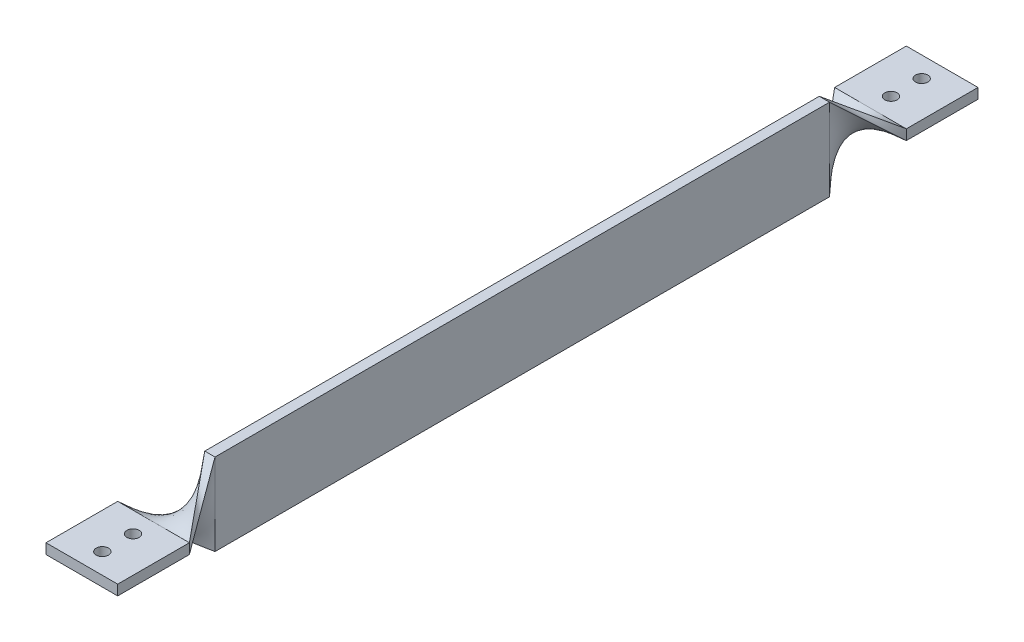
ISO-10303-21;
HEADER;
FILE_DESCRIPTION(('STEP AP214'),'2;1');
FILE_NAME('part.step','',(''),(''),'','','');
FILE_SCHEMA(('AUTOMOTIVE_DESIGN { 1 0 10303 214 1 1 1 1 }'));
ENDSEC;
DATA;
#1=APPLICATION_CONTEXT('core data for automotive mechanical design processes');
#2=APPLICATION_PROTOCOL_DEFINITION('international standard','automotive_design',2000,#1);
#3=PRODUCT_CONTEXT('',#1,'mechanical');
#4=PRODUCT('Part','Part','',(#3));
#5=PRODUCT_RELATED_PRODUCT_CATEGORY('part','',(#4));
#6=PRODUCT_DEFINITION_FORMATION('','',#4);
#7=PRODUCT_DEFINITION_CONTEXT('part definition',#1,'design');
#8=PRODUCT_DEFINITION('design','',#6,#7);
#9=PRODUCT_DEFINITION_SHAPE('','',#8);
#10=(LENGTH_UNIT() NAMED_UNIT(*) SI_UNIT(.MILLI.,.METRE.));
#11=(NAMED_UNIT(*) PLANE_ANGLE_UNIT() SI_UNIT($,.RADIAN.));
#12=(NAMED_UNIT(*) SI_UNIT($,.STERADIAN.) SOLID_ANGLE_UNIT());
#13=UNCERTAINTY_MEASURE_WITH_UNIT(LENGTH_MEASURE(1.E-05),#10,'distance_accuracy_value','');
#14=(GEOMETRIC_REPRESENTATION_CONTEXT(3) GLOBAL_UNCERTAINTY_ASSIGNED_CONTEXT((#13)) GLOBAL_UNIT_ASSIGNED_CONTEXT((#10,
#11,#12)) REPRESENTATION_CONTEXT('',''));
#15=CARTESIAN_POINT('',(0.,0.,0.));
#16=DIRECTION('',(0.,0.,1.));
#17=DIRECTION('',(1.,0.,0.));
#18=AXIS2_PLACEMENT_3D('',#15,#16,#17);
#19=CARTESIAN_POINT('',(0.,0.,17.5));
#20=DIRECTION('',(1.,0.,0.));
#21=DIRECTION('',(0.,0.,-1.));
#22=AXIS2_PLACEMENT_3D('',#19,#20,#21);
#23=PLANE('',#22);
#24=DIRECTION('',(0.,-1.,0.));
#25=VECTOR('',#24,1.);
#26=CARTESIAN_POINT('',(0.,0.,-17.5));
#27=LINE('',#26,#25);
#28=CARTESIAN_POINT('',(0.,5.,-17.5));
#29=VERTEX_POINT('',#28);
#30=CARTESIAN_POINT('',(0.,0.,-17.5));
#31=VERTEX_POINT('',#30);
#32=EDGE_CURVE('E145',#29,#31,#27,.T.);
#33=ORIENTED_EDGE('',*,*,#32,.T.);
#34=DIRECTION('',(0.,0.,-1.));
#35=VECTOR('',#34,1.);
#36=CARTESIAN_POINT('',(0.,0.,17.5));
#37=LINE('',#36,#35);
#38=CARTESIAN_POINT('',(0.,0.,17.5));
#39=VERTEX_POINT('',#38);
#40=EDGE_CURVE('E12',#39,#31,#37,.T.);
#41=ORIENTED_EDGE('',*,*,#40,.F.);
#42=DIRECTION('',(0.,1.,0.));
#43=VECTOR('',#42,1.);
#44=CARTESIAN_POINT('',(0.,0.,17.5));
#45=LINE('',#44,#43);
#46=CARTESIAN_POINT('',(0.,5.,17.5));
#47=VERTEX_POINT('',#46);
#48=EDGE_CURVE('E138',#47,#39,#45,.F.);
#49=ORIENTED_EDGE('',*,*,#48,.F.);
#50=DIRECTION('',(0.,0.,-1.));
#51=VECTOR('',#50,1.);
#52=CARTESIAN_POINT('',(0.,5.,17.5));
#53=LINE('',#52,#51);
#54=EDGE_CURVE('E133',#47,#29,#53,.T.);
#55=ORIENTED_EDGE('',*,*,#54,.T.);
#56=EDGE_LOOP('',(#33,#41,#49,#55));
#57=FACE_BOUND('',#56,.T.);
#58=ADVANCED_FACE('F54',(#57),#23,.F.);
#59=CARTESIAN_POINT('',(0.,0.,17.5));
#60=DIRECTION('',(0.,1.,0.));
#61=DIRECTION('',(0.,0.,1.));
#62=AXIS2_PLACEMENT_3D('',#59,#60,#61);
#63=PLANE('',#62);
#64=CARTESIAN_POINT('',(17.5,0.,-7.5));
#65=DIRECTION('',(0.,1.,0.));
#66=DIRECTION('',(0.,0.,1.));
#67=AXIS2_PLACEMENT_3D('',#64,#65,#66);
#68=CIRCLE('',#67,3.);
#69=CARTESIAN_POINT('',(17.5,0.,-4.5));
#70=VERTEX_POINT('',#69);
#71=EDGE_CURVE('E385',#70,#70,#68,.T.);
#72=ORIENTED_EDGE('',*,*,#71,.T.);
#73=EDGE_LOOP('',(#72));
#74=FACE_BOUND('',#73,.T.);
#75=CARTESIAN_POINT('',(17.5,0.,7.5));
#76=DIRECTION('',(0.,1.,0.));
#77=DIRECTION('',(0.,0.,1.));
#78=AXIS2_PLACEMENT_3D('',#75,#76,#77);
#79=CIRCLE('',#78,3.);
#80=CARTESIAN_POINT('',(17.5,0.,10.5));
#81=VERTEX_POINT('',#80);
#82=EDGE_CURVE('E389',#81,#81,#79,.T.);
#83=ORIENTED_EDGE('',*,*,#82,.T.);
#84=EDGE_LOOP('',(#83));
#85=FACE_BOUND('',#84,.T.);
#86=DIRECTION('',(1.,0.,0.));
#87=VECTOR('',#86,1.);
#88=CARTESIAN_POINT('',(0.,0.,-17.5));
#89=LINE('',#88,#87);
#90=CARTESIAN_POINT('',(35.,0.,-17.5));
#91=VERTEX_POINT('',#90);
#92=EDGE_CURVE('E150',#31,#91,#89,.T.);
#93=ORIENTED_EDGE('',*,*,#92,.T.);
#94=DIRECTION('',(0.,0.,-1.));
#95=VECTOR('',#94,1.);
#96=CARTESIAN_POINT('',(35.,0.,17.5));
#97=LINE('',#96,#95);
#98=CARTESIAN_POINT('',(35.,0.,17.5));
#99=VERTEX_POINT('',#98);
#100=EDGE_CURVE('E64',#99,#91,#97,.T.);
#101=ORIENTED_EDGE('',*,*,#100,.F.);
#102=DIRECTION('',(1.,0.,0.));
#103=VECTOR('',#102,1.);
#104=CARTESIAN_POINT('',(0.,0.,17.5));
#105=LINE('',#104,#103);
#106=EDGE_CURVE('E166',#39,#99,#105,.T.);
#107=ORIENTED_EDGE('',*,*,#106,.F.);
#108=ORIENTED_EDGE('',*,*,#40,.T.);
#109=EDGE_LOOP('',(#93,#101,#107,#108));
#110=FACE_BOUND('',#109,.T.);
#111=ADVANCED_FACE('F376',(#74,#85,#110),#63,.F.);
#112=CARTESIAN_POINT('',(35.,0.,17.5));
#113=DIRECTION('',(-1.,0.,0.));
#114=DIRECTION('',(0.,0.,1.));
#115=AXIS2_PLACEMENT_3D('',#112,#113,#114);
#116=PLANE('',#115);
#117=DIRECTION('',(0.,1.,0.));
#118=VECTOR('',#117,1.);
#119=CARTESIAN_POINT('',(35.,0.,-17.5));
#120=LINE('',#119,#118);
#121=CARTESIAN_POINT('',(35.,5.,-17.5));
#122=VERTEX_POINT('',#121);
#123=EDGE_CURVE('E139',#91,#122,#120,.T.);
#124=ORIENTED_EDGE('',*,*,#123,.T.);
#125=DIRECTION('',(0.,0.,-1.));
#126=VECTOR('',#125,1.);
#127=CARTESIAN_POINT('',(35.,5.,17.5));
#128=LINE('',#127,#126);
#129=CARTESIAN_POINT('',(35.,5.,17.5));
#130=VERTEX_POINT('',#129);
#131=EDGE_CURVE('E73',#130,#122,#128,.T.);
#132=ORIENTED_EDGE('',*,*,#131,.F.);
#133=DIRECTION('',(0.,1.,0.));
#134=VECTOR('',#133,1.);
#135=CARTESIAN_POINT('',(35.,0.,17.5));
#136=LINE('',#135,#134);
#137=EDGE_CURVE('E169',#99,#130,#136,.T.);
#138=ORIENTED_EDGE('',*,*,#137,.F.);
#139=ORIENTED_EDGE('',*,*,#100,.T.);
#140=EDGE_LOOP('',(#124,#132,#138,#139));
#141=FACE_BOUND('',#140,.T.);
#142=ADVANCED_FACE('F373',(#141),#116,.F.);
#143=CARTESIAN_POINT('',(0.,5.,17.5));
#144=DIRECTION('',(0.,-1.,0.));
#145=DIRECTION('',(1.,0.,0.));
#146=AXIS2_PLACEMENT_3D('',#143,#144,#145);
#147=PLANE('',#146);
#148=CARTESIAN_POINT('',(17.5,5.,-7.5));
#149=DIRECTION('',(0.,1.,0.));
#150=DIRECTION('',(0.,0.,1.));
#151=AXIS2_PLACEMENT_3D('',#148,#149,#150);
#152=CIRCLE('',#151,3.);
#153=CARTESIAN_POINT('',(17.5,5.,-4.5));
#154=VERTEX_POINT('',#153);
#155=EDGE_CURVE('E613',#154,#154,#152,.T.);
#156=ORIENTED_EDGE('',*,*,#155,.F.);
#157=EDGE_LOOP('',(#156));
#158=FACE_BOUND('',#157,.T.);
#159=CARTESIAN_POINT('',(17.5,5.,7.5));
#160=DIRECTION('',(0.,1.,0.));
#161=DIRECTION('',(0.,0.,1.));
#162=AXIS2_PLACEMENT_3D('',#159,#160,#161);
#163=CIRCLE('',#162,3.);
#164=CARTESIAN_POINT('',(17.5,5.,10.5));
#165=VERTEX_POINT('',#164);
#166=EDGE_CURVE('E614',#165,#165,#163,.T.);
#167=ORIENTED_EDGE('',*,*,#166,.F.);
#168=EDGE_LOOP('',(#167));
#169=FACE_BOUND('',#168,.T.);
#170=DIRECTION('',(-1.,0.,0.));
#171=VECTOR('',#170,1.);
#172=CARTESIAN_POINT('',(0.,5.,-17.5));
#173=LINE('',#172,#171);
#174=EDGE_CURVE('E130',#122,#29,#173,.T.);
#175=ORIENTED_EDGE('',*,*,#174,.T.);
#176=ORIENTED_EDGE('',*,*,#54,.F.);
#177=DIRECTION('',(1.,0.,0.));
#178=VECTOR('',#177,1.);
#179=CARTESIAN_POINT('',(0.,5.,17.5));
#180=LINE('',#179,#178);
#181=EDGE_CURVE('E147',#130,#47,#180,.F.);
#182=ORIENTED_EDGE('',*,*,#181,.F.);
#183=ORIENTED_EDGE('',*,*,#131,.T.);
#184=EDGE_LOOP('',(#175,#176,#182,#183));
#185=FACE_BOUND('',#184,.T.);
#186=ADVANCED_FACE('F132',(#158,#169,#185),#147,.F.);
#187=CARTESIAN_POINT('',(0.,0.,-17.5));
#188=DIRECTION('',(0.,0.,-1.));
#189=DIRECTION('',(-1.,0.,0.));
#190=AXIS2_PLACEMENT_3D('',#187,#188,#189);
#191=PLANE('',#190);
#192=ORIENTED_EDGE('',*,*,#32,.F.);
#193=ORIENTED_EDGE('',*,*,#174,.F.);
#194=ORIENTED_EDGE('',*,*,#123,.F.);
#195=ORIENTED_EDGE('',*,*,#92,.F.);
#196=EDGE_LOOP('',(#192,#193,#194,#195));
#197=FACE_BOUND('',#196,.T.);
#198=ADVANCED_FACE('F149',(#197),#191,.T.);
#199=CARTESIAN_POINT('',(35.,0.,17.5));
#200=CARTESIAN_POINT('',(22.5,22.5,42.5));
#201=CARTESIAN_POINT('',(35.,0.833333333333334,17.5));
#202=CARTESIAN_POINT('',(21.6666666666667,22.5,42.5));
#203=CARTESIAN_POINT('',(35.,1.66666666666667,17.5));
#204=CARTESIAN_POINT('',(20.8333333333334,22.5,42.5));
#205=CARTESIAN_POINT('',(35.,3.33333333333333,17.5));
#206=CARTESIAN_POINT('',(19.1666666666667,22.5,42.5));
#207=CARTESIAN_POINT('',(35.,4.16666666666667,17.5));
#208=CARTESIAN_POINT('',(18.3333333333333,22.5,42.5));
#209=CARTESIAN_POINT('',(35.,5.,17.5));
#210=CARTESIAN_POINT('',(17.5,22.5,42.5));
#211=B_SPLINE_SURFACE_WITH_KNOTS('',3,1,((#199,#200),(#201,#202),(#203,#204),(#205,#206),(#207,
#208),(#209,#210)),.UNSPECIFIED.,.F.,.F.,.F.,(4,2,4),(2,2),(0.,0.5,1.),(0.,1.),.UNSPECIFIED.);
#212=DIRECTION('',(-0.497468338163091,0.497468338163091,0.710669054518701));
#213=VECTOR('',#212,1.);
#214=CARTESIAN_POINT('',(26.25,13.75,30.));
#215=LINE('',#214,#213);
#216=CARTESIAN_POINT('',(17.5,22.5,42.5));
#217=VERTEX_POINT('',#216);
#218=EDGE_CURVE('E106',#130,#217,#215,.T.);
#219=DIRECTION('',(-1.,0.,0.));
#220=VECTOR('',#219,1.);
#221=CARTESIAN_POINT('',(17.5,22.5,42.5));
#222=LINE('',#221,#220);
#223=CARTESIAN_POINT('',(22.5,22.5,42.5));
#224=VERTEX_POINT('',#223);
#225=EDGE_CURVE('E185',#224,#217,#222,.T.);
#226=DIRECTION('',(0.348366507145809,-0.627059712862456,-0.696733014291618));
#227=VECTOR('',#226,1.);
#228=CARTESIAN_POINT('',(28.75,11.25,30.));
#229=LINE('',#228,#227);
#230=EDGE_CURVE('E322',#224,#99,#229,.T.);
#231=ORIENTED_EDGE('',*,*,#137,.T.);
#232=ORIENTED_EDGE('',*,*,#218,.T.);
#233=ORIENTED_EDGE('',*,*,#225,.F.);
#234=ORIENTED_EDGE('',*,*,#230,.T.);
#235=EDGE_LOOP('',(#231,#232,#233,#234));
#236=FACE_BOUND('',#235,.T.);
#237=ADVANCED_FACE('F370',(#236),#211,.T.);
#238=CARTESIAN_POINT('',(35.,5.,17.5));
#239=CARTESIAN_POINT('',(17.5,22.5,42.5));
#240=CARTESIAN_POINT('',(29.1666666666665,5.,17.5));
#241=CARTESIAN_POINT('',(17.5,15.8333333333333,42.5));
#242=CARTESIAN_POINT('',(23.333333333333,5.,17.5));
#243=CARTESIAN_POINT('',(17.5,9.16666666666665,42.5));
#244=CARTESIAN_POINT('',(11.6666666666663,5.,17.5));
#245=CARTESIAN_POINT('',(17.5,-4.16666666666668,42.5));
#246=CARTESIAN_POINT('',(5.83333333333312,5.,17.5));
#247=CARTESIAN_POINT('',(17.5,-10.8333333333333,42.5));
#248=CARTESIAN_POINT('',(0.,5.,17.5));
#249=CARTESIAN_POINT('',(17.5,-17.5,42.5));
#250=B_SPLINE_SURFACE_WITH_KNOTS('',3,1,((#238,#239),(#240,#241),(#242,#243),(#244,#245),(#246,
#247),(#248,#249)),.UNSPECIFIED.,.F.,.F.,.F.,(4,2,4),(2,2),(0.,0.5,1.),(0.,1.),.UNSPECIFIED.);
#251=DIRECTION('',(0.461566331377051,-0.593442426056208,0.659380473395787));
#252=VECTOR('',#251,1.);
#253=CARTESIAN_POINT('',(8.75,-6.25,30.));
#254=LINE('',#253,#252);
#255=CARTESIAN_POINT('',(17.5,-17.5,42.5));
#256=VERTEX_POINT('',#255);
#257=EDGE_CURVE('E321',#47,#256,#254,.T.);
#258=DIRECTION('',(0.,-1.,0.));
#259=VECTOR('',#258,1.);
#260=CARTESIAN_POINT('',(17.5,22.5,42.5));
#261=LINE('',#260,#259);
#262=EDGE_CURVE('E237',#217,#256,#261,.T.);
#263=ORIENTED_EDGE('',*,*,#181,.T.);
#264=ORIENTED_EDGE('',*,*,#257,.T.);
#265=ORIENTED_EDGE('',*,*,#262,.F.);
#266=ORIENTED_EDGE('',*,*,#218,.F.);
#267=EDGE_LOOP('',(#263,#264,#265,#266));
#268=FACE_BOUND('',#267,.T.);
#269=ADVANCED_FACE('F410',(#268),#250,.T.);
#270=CARTESIAN_POINT('',(0.,0.,17.5));
#271=CARTESIAN_POINT('',(22.5,-17.5,42.5));
#272=CARTESIAN_POINT('',(5.83333333333336,0.,17.5));
#273=CARTESIAN_POINT('',(22.5,-10.8333333333333,42.5));
#274=CARTESIAN_POINT('',(11.6666666666667,0.,17.5));
#275=CARTESIAN_POINT('',(22.5,-4.16666666666668,42.5));
#276=CARTESIAN_POINT('',(23.3333333333334,0.,17.5));
#277=CARTESIAN_POINT('',(22.5,9.16666666666666,42.5));
#278=CARTESIAN_POINT('',(29.1666666666667,0.,17.5));
#279=CARTESIAN_POINT('',(22.5,15.8333333333333,42.5));
#280=CARTESIAN_POINT('',(35.,0.,17.5));
#281=CARTESIAN_POINT('',(22.5,22.5,42.5));
#282=B_SPLINE_SURFACE_WITH_KNOTS('',3,1,((#270,#271),(#272,#273),(#274,#275),(#276,#277),(#278,
#279),(#280,#281)),.UNSPECIFIED.,.F.,.F.,.F.,(4,2,4),(2,2),(0.,0.5,1.),(0.,1.),.UNSPECIFIED.);
#283=DIRECTION('',(0.,1.,0.));
#284=VECTOR('',#283,1.);
#285=CARTESIAN_POINT('',(22.5,22.5,42.5));
#286=LINE('',#285,#284);
#287=CARTESIAN_POINT('',(22.5,-17.5,42.5));
#288=VERTEX_POINT('',#287);
#289=EDGE_CURVE('E155',#288,#224,#286,.T.);
#290=DIRECTION('',(0.593442426056208,-0.461566331377051,0.659380473395787));
#291=VECTOR('',#290,1.);
#292=CARTESIAN_POINT('',(11.25,-8.75,30.));
#293=LINE('',#292,#291);
#294=EDGE_CURVE('E241',#39,#288,#293,.T.);
#295=ORIENTED_EDGE('',*,*,#106,.T.);
#296=ORIENTED_EDGE('',*,*,#230,.F.);
#297=ORIENTED_EDGE('',*,*,#289,.F.);
#298=ORIENTED_EDGE('',*,*,#294,.F.);
#299=EDGE_LOOP('',(#295,#296,#297,#298));
#300=FACE_BOUND('',#299,.T.);
#301=ADVANCED_FACE('F358',(#300),#282,.T.);
#302=CARTESIAN_POINT('',(0.,5.,17.5));
#303=CARTESIAN_POINT('',(17.5,-17.5,42.5));
#304=CARTESIAN_POINT('',(0.,4.16666666666667,17.5));
#305=CARTESIAN_POINT('',(18.3333333333333,-17.5,42.5));
#306=CARTESIAN_POINT('',(0.,3.33333333333334,17.5));
#307=CARTESIAN_POINT('',(19.1666666666667,-17.5,42.5));
#308=CARTESIAN_POINT('',(0.,1.66666666666667,17.5));
#309=CARTESIAN_POINT('',(20.8333333333333,-17.5,42.5));
#310=CARTESIAN_POINT('',(0.,0.833333333333337,17.5));
#311=CARTESIAN_POINT('',(21.6666666666667,-17.5,42.5));
#312=CARTESIAN_POINT('',(0.,0.,17.5));
#313=CARTESIAN_POINT('',(22.5,-17.5,42.5));
#314=B_SPLINE_SURFACE_WITH_KNOTS('',3,1,((#302,#303),(#304,#305),(#306,#307),(#308,#309),(#310,
#311),(#312,#313)),.UNSPECIFIED.,.F.,.F.,.F.,(4,2,4),(2,2),(0.,0.5,1.),(0.,1.),.UNSPECIFIED.);
#315=DIRECTION('',(1.,0.,0.));
#316=VECTOR('',#315,1.);
#317=CARTESIAN_POINT('',(17.5,-17.5,42.5));
#318=LINE('',#317,#316);
#319=EDGE_CURVE('E151',#256,#288,#318,.T.);
#320=ORIENTED_EDGE('',*,*,#48,.T.);
#321=ORIENTED_EDGE('',*,*,#294,.T.);
#322=ORIENTED_EDGE('',*,*,#319,.F.);
#323=ORIENTED_EDGE('',*,*,#257,.F.);
#324=EDGE_LOOP('',(#320,#321,#322,#323));
#325=FACE_BOUND('',#324,.T.);
#326=ADVANCED_FACE('F345',(#325),#314,.T.);
#327=CARTESIAN_POINT('',(17.5,22.5,342.5));
#328=DIRECTION('',(1.,0.,0.));
#329=DIRECTION('',(0.,1.,0.));
#330=AXIS2_PLACEMENT_3D('',#327,#328,#329);
#331=PLANE('',#330);
#332=ORIENTED_EDGE('',*,*,#262,.T.);
#333=DIRECTION('',(0.,0.,-1.));
#334=VECTOR('',#333,1.);
#335=CARTESIAN_POINT('',(17.5,-17.5,342.5));
#336=LINE('',#335,#334);
#337=CARTESIAN_POINT('',(17.5,-17.5,342.5));
#338=VERTEX_POINT('',#337);
#339=EDGE_CURVE('E334',#338,#256,#336,.T.);
#340=ORIENTED_EDGE('',*,*,#339,.F.);
#341=DIRECTION('',(0.,1.,0.));
#342=VECTOR('',#341,1.);
#343=CARTESIAN_POINT('',(17.5,22.5,342.5));
#344=LINE('',#343,#342);
#345=CARTESIAN_POINT('',(17.5,22.5,342.5));
#346=VERTEX_POINT('',#345);
#347=EDGE_CURVE('E245',#346,#338,#344,.F.);
#348=ORIENTED_EDGE('',*,*,#347,.F.);
#349=DIRECTION('',(0.,0.,-1.));
#350=VECTOR('',#349,1.);
#351=CARTESIAN_POINT('',(17.5,22.5,342.5));
#352=LINE('',#351,#350);
#353=EDGE_CURVE('E173',#346,#217,#352,.T.);
#354=ORIENTED_EDGE('',*,*,#353,.T.);
#355=EDGE_LOOP('',(#332,#340,#348,#354));
#356=FACE_BOUND('',#355,.T.);
#357=ADVANCED_FACE('F357',(#356),#331,.F.);
#358=CARTESIAN_POINT('',(17.5,-17.5,342.5));
#359=DIRECTION('',(0.,1.,0.));
#360=DIRECTION('',(0.,0.,1.));
#361=AXIS2_PLACEMENT_3D('',#358,#359,#360);
#362=PLANE('',#361);
#363=ORIENTED_EDGE('',*,*,#319,.T.);
#364=DIRECTION('',(0.,0.,-1.));
#365=VECTOR('',#364,1.);
#366=CARTESIAN_POINT('',(22.5,-17.5,342.5));
#367=LINE('',#366,#365);
#368=CARTESIAN_POINT('',(22.5,-17.5,342.5));
#369=VERTEX_POINT('',#368);
#370=EDGE_CURVE('E228',#369,#288,#367,.T.);
#371=ORIENTED_EDGE('',*,*,#370,.F.);
#372=DIRECTION('',(1.,0.,0.));
#373=VECTOR('',#372,1.);
#374=CARTESIAN_POINT('',(17.5,-17.5,342.5));
#375=LINE('',#374,#373);
#376=EDGE_CURVE('E98',#338,#369,#375,.T.);
#377=ORIENTED_EDGE('',*,*,#376,.F.);
#378=ORIENTED_EDGE('',*,*,#339,.T.);
#379=EDGE_LOOP('',(#363,#371,#377,#378));
#380=FACE_BOUND('',#379,.T.);
#381=ADVANCED_FACE('F211',(#380),#362,.F.);
#382=CARTESIAN_POINT('',(22.5,22.5,342.5));
#383=DIRECTION('',(-1.,0.,0.));
#384=DIRECTION('',(0.,-1.,0.));
#385=AXIS2_PLACEMENT_3D('',#382,#383,#384);
#386=PLANE('',#385);
#387=ORIENTED_EDGE('',*,*,#289,.T.);
#388=DIRECTION('',(0.,0.,-1.));
#389=VECTOR('',#388,1.);
#390=CARTESIAN_POINT('',(22.5,22.5,342.5));
#391=LINE('',#390,#389);
#392=CARTESIAN_POINT('',(22.5,22.5,342.5));
#393=VERTEX_POINT('',#392);
#394=EDGE_CURVE('E176',#393,#224,#391,.T.);
#395=ORIENTED_EDGE('',*,*,#394,.F.);
#396=DIRECTION('',(0.,-1.,0.));
#397=VECTOR('',#396,1.);
#398=CARTESIAN_POINT('',(22.5,22.5,342.5));
#399=LINE('',#398,#397);
#400=EDGE_CURVE('E251',#369,#393,#399,.F.);
#401=ORIENTED_EDGE('',*,*,#400,.F.);
#402=ORIENTED_EDGE('',*,*,#370,.T.);
#403=EDGE_LOOP('',(#387,#395,#401,#402));
#404=FACE_BOUND('',#403,.T.);
#405=ADVANCED_FACE('F202',(#404),#386,.F.);
#406=CARTESIAN_POINT('',(17.5,22.5,342.5));
#407=DIRECTION('',(0.,-1.,0.));
#408=DIRECTION('',(0.,0.,-1.));
#409=AXIS2_PLACEMENT_3D('',#406,#407,#408);
#410=PLANE('',#409);
#411=ORIENTED_EDGE('',*,*,#225,.T.);
#412=ORIENTED_EDGE('',*,*,#353,.F.);
#413=DIRECTION('',(1.,0.,0.));
#414=VECTOR('',#413,1.);
#415=CARTESIAN_POINT('',(17.5,22.5,342.5));
#416=LINE('',#415,#414);
#417=EDGE_CURVE('E177',#393,#346,#416,.F.);
#418=ORIENTED_EDGE('',*,*,#417,.F.);
#419=ORIENTED_EDGE('',*,*,#394,.T.);
#420=EDGE_LOOP('',(#411,#412,#418,#419));
#421=FACE_BOUND('',#420,.T.);
#422=ADVANCED_FACE('F191',(#421),#410,.F.);
#423=CARTESIAN_POINT('',(35.,0.,367.5));
#424=CARTESIAN_POINT('',(22.5,22.5,342.5));
#425=CARTESIAN_POINT('',(29.1666666666665,0.,367.5));
#426=CARTESIAN_POINT('',(22.5,15.8333333333333,342.5));
#427=CARTESIAN_POINT('',(23.333333333333,0.,367.5));
#428=CARTESIAN_POINT('',(22.5,9.16666666666669,342.5));
#429=CARTESIAN_POINT('',(11.6666666666663,0.,367.5));
#430=CARTESIAN_POINT('',(22.5,-4.16666666666664,342.5));
#431=CARTESIAN_POINT('',(5.83333333333312,0.,367.5));
#432=CARTESIAN_POINT('',(22.5,-10.8333333333333,342.5));
#433=CARTESIAN_POINT('',(0.,0.,367.5));
#434=CARTESIAN_POINT('',(22.5,-17.5,342.5));
#435=B_SPLINE_SURFACE_WITH_KNOTS('',3,1,((#423,#424),(#425,#426),(#427,#428),(#429,#430),(#431,
#432),(#433,#434)),.UNSPECIFIED.,.F.,.F.,.F.,(4,2,4),(2,2),(0.,0.5,1.),(0.,1.),.UNSPECIFIED.);
#436=DIRECTION('',(1.,0.,0.));
#437=VECTOR('',#436,1.);
#438=CARTESIAN_POINT('',(0.,0.,367.5));
#439=LINE('',#438,#437);
#440=CARTESIAN_POINT('',(0.,0.,367.5));
#441=VERTEX_POINT('',#440);
#442=CARTESIAN_POINT('',(35.,0.,367.5));
#443=VERTEX_POINT('',#442);
#444=EDGE_CURVE('E312',#441,#443,#439,.T.);
#445=DIRECTION('',(0.593442426056208,-0.461566331377051,-0.659380473395787));
#446=VECTOR('',#445,1.);
#447=CARTESIAN_POINT('',(11.25,-8.75,355.));
#448=LINE('',#447,#446);
#449=EDGE_CURVE('E467',#441,#369,#448,.T.);
#450=DIRECTION('',(0.348366507145809,-0.627059712862456,0.696733014291618));
#451=VECTOR('',#450,1.);
#452=CARTESIAN_POINT('',(28.75,11.25,355.));
#453=LINE('',#452,#451);
#454=EDGE_CURVE('E464',#393,#443,#453,.T.);
#455=ORIENTED_EDGE('',*,*,#444,.F.);
#456=ORIENTED_EDGE('',*,*,#449,.T.);
#457=ORIENTED_EDGE('',*,*,#400,.T.);
#458=ORIENTED_EDGE('',*,*,#454,.T.);
#459=EDGE_LOOP('',(#455,#456,#457,#458));
#460=FACE_BOUND('',#459,.T.);
#461=ADVANCED_FACE('F201',(#460),#435,.T.);
#462=CARTESIAN_POINT('',(0.,0.,367.5));
#463=CARTESIAN_POINT('',(22.5,-17.5,342.5));
#464=CARTESIAN_POINT('',(0.,0.833333333333333,367.5));
#465=CARTESIAN_POINT('',(21.6666666666667,-17.5,342.5));
#466=CARTESIAN_POINT('',(0.,1.66666666666666,367.5));
#467=CARTESIAN_POINT('',(20.8333333333333,-17.5,342.5));
#468=CARTESIAN_POINT('',(0.,3.33333333333333,367.5));
#469=CARTESIAN_POINT('',(19.1666666666667,-17.5,342.5));
#470=CARTESIAN_POINT('',(0.,4.16666666666666,367.5));
#471=CARTESIAN_POINT('',(18.3333333333333,-17.5,342.5));
#472=CARTESIAN_POINT('',(0.,5.,367.5));
#473=CARTESIAN_POINT('',(17.5,-17.5,342.5));
#474=B_SPLINE_SURFACE_WITH_KNOTS('',3,1,((#462,#463),(#464,#465),(#466,#467),(#468,#469),(#470,
#471),(#472,#473)),.UNSPECIFIED.,.F.,.F.,.F.,(4,2,4),(2,2),(0.,0.5,1.),(0.,1.),.UNSPECIFIED.);
#475=DIRECTION('',(0.,-1.,0.));
#476=VECTOR('',#475,1.);
#477=CARTESIAN_POINT('',(0.,5.,367.5));
#478=LINE('',#477,#476);
#479=CARTESIAN_POINT('',(0.,5.,367.5));
#480=VERTEX_POINT('',#479);
#481=EDGE_CURVE('E57',#480,#441,#478,.T.);
#482=DIRECTION('',(0.461566331377051,-0.593442426056208,-0.659380473395787));
#483=VECTOR('',#482,1.);
#484=CARTESIAN_POINT('',(8.75,-6.25,355.));
#485=LINE('',#484,#483);
#486=EDGE_CURVE('E472',#480,#338,#485,.T.);
#487=ORIENTED_EDGE('',*,*,#481,.F.);
#488=ORIENTED_EDGE('',*,*,#486,.T.);
#489=ORIENTED_EDGE('',*,*,#376,.T.);
#490=ORIENTED_EDGE('',*,*,#449,.F.);
#491=EDGE_LOOP('',(#487,#488,#489,#490));
#492=FACE_BOUND('',#491,.T.);
#493=ADVANCED_FACE('F495',(#492),#474,.T.);
#494=CARTESIAN_POINT('',(35.,5.,367.5));
#495=CARTESIAN_POINT('',(17.5,22.5,342.5));
#496=CARTESIAN_POINT('',(35.,4.16666666666667,367.5));
#497=CARTESIAN_POINT('',(18.3333333333333,22.5,342.5));
#498=CARTESIAN_POINT('',(35.,3.33333333333334,367.5));
#499=CARTESIAN_POINT('',(19.1666666666667,22.5,342.5));
#500=CARTESIAN_POINT('',(35.,1.66666666666667,367.5));
#501=CARTESIAN_POINT('',(20.8333333333334,22.5,342.5));
#502=CARTESIAN_POINT('',(35.,0.833333333333334,367.5));
#503=CARTESIAN_POINT('',(21.6666666666667,22.5,342.5));
#504=CARTESIAN_POINT('',(35.,0.,367.5));
#505=CARTESIAN_POINT('',(22.5,22.5,342.5));
#506=B_SPLINE_SURFACE_WITH_KNOTS('',3,1,((#494,#495),(#496,#497),(#498,#499),(#500,#501),(#502,
#503),(#504,#505)),.UNSPECIFIED.,.F.,.F.,.F.,(4,2,4),(2,2),(0.,0.5,1.),(0.,1.),.UNSPECIFIED.);
#507=DIRECTION('',(0.,1.,0.));
#508=VECTOR('',#507,1.);
#509=CARTESIAN_POINT('',(35.,5.,367.5));
#510=LINE('',#509,#508);
#511=CARTESIAN_POINT('',(35.,5.,367.5));
#512=VERTEX_POINT('',#511);
#513=EDGE_CURVE('E304',#443,#512,#510,.T.);
#514=DIRECTION('',(-0.497468338163091,0.497468338163091,-0.710669054518702));
#515=VECTOR('',#514,1.);
#516=CARTESIAN_POINT('',(26.25,13.75,355.));
#517=LINE('',#516,#515);
#518=EDGE_CURVE('E248',#512,#346,#517,.T.);
#519=ORIENTED_EDGE('',*,*,#513,.F.);
#520=ORIENTED_EDGE('',*,*,#454,.F.);
#521=ORIENTED_EDGE('',*,*,#417,.T.);
#522=ORIENTED_EDGE('',*,*,#518,.F.);
#523=EDGE_LOOP('',(#519,#520,#521,#522));
#524=FACE_BOUND('',#523,.T.);
#525=ADVANCED_FACE('F469',(#524),#506,.T.);
#526=CARTESIAN_POINT('',(0.,5.,367.5));
#527=CARTESIAN_POINT('',(17.5,-17.5,342.5));
#528=CARTESIAN_POINT('',(5.83333333333333,5.,367.5));
#529=CARTESIAN_POINT('',(17.5,-10.8333333333333,342.5));
#530=CARTESIAN_POINT('',(11.6666666666667,5.,367.5));
#531=CARTESIAN_POINT('',(17.5,-4.16666666666668,342.5));
#532=CARTESIAN_POINT('',(23.3333333333333,5.,367.5));
#533=CARTESIAN_POINT('',(17.5,9.16666666666665,342.5));
#534=CARTESIAN_POINT('',(29.1666666666667,5.,367.5));
#535=CARTESIAN_POINT('',(17.5,15.8333333333333,342.5));
#536=CARTESIAN_POINT('',(35.,5.,367.5));
#537=CARTESIAN_POINT('',(17.5,22.5,342.5));
#538=B_SPLINE_SURFACE_WITH_KNOTS('',3,1,((#526,#527),(#528,#529),(#530,#531),(#532,#533),(#534,
#535),(#536,#537)),.UNSPECIFIED.,.F.,.F.,.F.,(4,2,4),(2,2),(0.,0.5,1.),(0.,1.),.UNSPECIFIED.);
#539=DIRECTION('',(-1.,0.,0.));
#540=VECTOR('',#539,1.);
#541=CARTESIAN_POINT('',(0.,5.,367.5));
#542=LINE('',#541,#540);
#543=EDGE_CURVE('E269',#512,#480,#542,.T.);
#544=ORIENTED_EDGE('',*,*,#543,.F.);
#545=ORIENTED_EDGE('',*,*,#518,.T.);
#546=ORIENTED_EDGE('',*,*,#347,.T.);
#547=ORIENTED_EDGE('',*,*,#486,.F.);
#548=EDGE_LOOP('',(#544,#545,#546,#547));
#549=FACE_BOUND('',#548,.T.);
#550=ADVANCED_FACE('F203',(#549),#538,.T.);
#551=CARTESIAN_POINT('',(0.,5.,402.5));
#552=DIRECTION('',(1.,0.,0.));
#553=DIRECTION('',(0.,0.,-1.));
#554=AXIS2_PLACEMENT_3D('',#551,#552,#553);
#555=PLANE('',#554);
#556=ORIENTED_EDGE('',*,*,#481,.T.);
#557=DIRECTION('',(0.,0.,-1.));
#558=VECTOR('',#557,1.);
#559=CARTESIAN_POINT('',(0.,0.,402.5));
#560=LINE('',#559,#558);
#561=CARTESIAN_POINT('',(0.,0.,402.5));
#562=VERTEX_POINT('',#561);
#563=EDGE_CURVE('E537',#562,#441,#560,.T.);
#564=ORIENTED_EDGE('',*,*,#563,.F.);
#565=DIRECTION('',(0.,-1.,0.));
#566=VECTOR('',#565,1.);
#567=CARTESIAN_POINT('',(0.,5.,402.5));
#568=LINE('',#567,#566);
#569=CARTESIAN_POINT('',(0.,5.,402.5));
#570=VERTEX_POINT('',#569);
#571=EDGE_CURVE('E592',#570,#562,#568,.T.);
#572=ORIENTED_EDGE('',*,*,#571,.F.);
#573=DIRECTION('',(0.,0.,-1.));
#574=VECTOR('',#573,1.);
#575=CARTESIAN_POINT('',(0.,5.,402.5));
#576=LINE('',#575,#574);
#577=EDGE_CURVE('E255',#570,#480,#576,.T.);
#578=ORIENTED_EDGE('',*,*,#577,.T.);
#579=EDGE_LOOP('',(#556,#564,#572,#578));
#580=FACE_BOUND('',#579,.T.);
#581=ADVANCED_FACE('F546',(#580),#555,.F.);
#582=CARTESIAN_POINT('',(0.,0.,402.5));
#583=DIRECTION('',(0.,1.,0.));
#584=DIRECTION('',(-1.,0.,0.));
#585=AXIS2_PLACEMENT_3D('',#582,#583,#584);
#586=PLANE('',#585);
#587=CARTESIAN_POINT('',(17.5,0.,392.5));
#588=DIRECTION('',(0.,1.,0.));
#589=DIRECTION('',(-1.,0.,0.));
#590=AXIS2_PLACEMENT_3D('',#587,#588,#589);
#591=CIRCLE('',#590,3.);
#592=CARTESIAN_POINT('',(14.5,0.,392.5));
#593=VERTEX_POINT('',#592);
#594=EDGE_CURVE('E597',#593,#593,#591,.T.);
#595=ORIENTED_EDGE('',*,*,#594,.T.);
#596=EDGE_LOOP('',(#595));
#597=FACE_BOUND('',#596,.T.);
#598=CARTESIAN_POINT('',(17.5,0.,377.5));
#599=DIRECTION('',(0.,1.,0.));
#600=DIRECTION('',(-1.,0.,0.));
#601=AXIS2_PLACEMENT_3D('',#598,#599,#600);
#602=CIRCLE('',#601,3.);
#603=CARTESIAN_POINT('',(14.5,0.,377.5));
#604=VERTEX_POINT('',#603);
#605=EDGE_CURVE('E602',#604,#604,#602,.T.);
#606=ORIENTED_EDGE('',*,*,#605,.T.);
#607=EDGE_LOOP('',(#606));
#608=FACE_BOUND('',#607,.T.);
#609=ORIENTED_EDGE('',*,*,#444,.T.);
#610=DIRECTION('',(0.,0.,-1.));
#611=VECTOR('',#610,1.);
#612=CARTESIAN_POINT('',(35.,0.,402.5));
#613=LINE('',#612,#611);
#614=CARTESIAN_POINT('',(35.,0.,402.5));
#615=VERTEX_POINT('',#614);
#616=EDGE_CURVE('E313',#615,#443,#613,.T.);
#617=ORIENTED_EDGE('',*,*,#616,.F.);
#618=DIRECTION('',(1.,0.,0.));
#619=VECTOR('',#618,1.);
#620=CARTESIAN_POINT('',(0.,0.,402.5));
#621=LINE('',#620,#619);
#622=EDGE_CURVE('E585',#562,#615,#621,.T.);
#623=ORIENTED_EDGE('',*,*,#622,.F.);
#624=ORIENTED_EDGE('',*,*,#563,.T.);
#625=EDGE_LOOP('',(#609,#617,#623,#624));
#626=FACE_BOUND('',#625,.T.);
#627=ADVANCED_FACE('F293',(#597,#608,#626),#586,.F.);
#628=CARTESIAN_POINT('',(35.,5.,402.5));
#629=DIRECTION('',(-1.,0.,0.));
#630=DIRECTION('',(0.,0.,1.));
#631=AXIS2_PLACEMENT_3D('',#628,#629,#630);
#632=PLANE('',#631);
#633=ORIENTED_EDGE('',*,*,#513,.T.);
#634=DIRECTION('',(0.,0.,-1.));
#635=VECTOR('',#634,1.);
#636=CARTESIAN_POINT('',(35.,5.,402.5));
#637=LINE('',#636,#635);
#638=CARTESIAN_POINT('',(35.,5.,402.5));
#639=VERTEX_POINT('',#638);
#640=EDGE_CURVE('E258',#639,#512,#637,.T.);
#641=ORIENTED_EDGE('',*,*,#640,.F.);
#642=DIRECTION('',(0.,1.,0.));
#643=VECTOR('',#642,1.);
#644=CARTESIAN_POINT('',(35.,5.,402.5));
#645=LINE('',#644,#643);
#646=EDGE_CURVE('E583',#615,#639,#645,.T.);
#647=ORIENTED_EDGE('',*,*,#646,.F.);
#648=ORIENTED_EDGE('',*,*,#616,.T.);
#649=EDGE_LOOP('',(#633,#641,#647,#648));
#650=FACE_BOUND('',#649,.T.);
#651=ADVANCED_FACE('F287',(#650),#632,.F.);
#652=CARTESIAN_POINT('',(0.,5.,402.5));
#653=DIRECTION('',(0.,-1.,0.));
#654=DIRECTION('',(1.,0.,0.));
#655=AXIS2_PLACEMENT_3D('',#652,#653,#654);
#656=PLANE('',#655);
#657=CARTESIAN_POINT('',(17.5,5.,392.5));
#658=DIRECTION('',(0.,1.,0.));
#659=DIRECTION('',(0.,0.,1.));
#660=AXIS2_PLACEMENT_3D('',#657,#658,#659);
#661=CIRCLE('',#660,3.);
#662=CARTESIAN_POINT('',(17.5,5.,395.5));
#663=VERTEX_POINT('',#662);
#664=EDGE_CURVE('E605',#663,#663,#661,.T.);
#665=ORIENTED_EDGE('',*,*,#664,.F.);
#666=EDGE_LOOP('',(#665));
#667=FACE_BOUND('',#666,.T.);
#668=CARTESIAN_POINT('',(17.5,5.,377.5));
#669=DIRECTION('',(0.,1.,0.));
#670=DIRECTION('',(0.,0.,1.));
#671=AXIS2_PLACEMENT_3D('',#668,#669,#670);
#672=CIRCLE('',#671,3.);
#673=CARTESIAN_POINT('',(17.5,5.,380.5));
#674=VERTEX_POINT('',#673);
#675=EDGE_CURVE('E606',#674,#674,#672,.T.);
#676=ORIENTED_EDGE('',*,*,#675,.F.);
#677=EDGE_LOOP('',(#676));
#678=FACE_BOUND('',#677,.T.);
#679=ORIENTED_EDGE('',*,*,#543,.T.);
#680=ORIENTED_EDGE('',*,*,#577,.F.);
#681=DIRECTION('',(-1.,0.,0.));
#682=VECTOR('',#681,1.);
#683=CARTESIAN_POINT('',(0.,5.,402.5));
#684=LINE('',#683,#682);
#685=EDGE_CURVE('E259',#639,#570,#684,.T.);
#686=ORIENTED_EDGE('',*,*,#685,.F.);
#687=ORIENTED_EDGE('',*,*,#640,.T.);
#688=EDGE_LOOP('',(#679,#680,#686,#687));
#689=FACE_BOUND('',#688,.T.);
#690=ADVANCED_FACE('F276',(#667,#678,#689),#656,.F.);
#691=CARTESIAN_POINT('',(0.,0.,402.5));
#692=DIRECTION('',(0.,0.,1.));
#693=DIRECTION('',(1.,0.,0.));
#694=AXIS2_PLACEMENT_3D('',#691,#692,#693);
#695=PLANE('',#694);
#696=ORIENTED_EDGE('',*,*,#571,.T.);
#697=ORIENTED_EDGE('',*,*,#622,.T.);
#698=ORIENTED_EDGE('',*,*,#646,.T.);
#699=ORIENTED_EDGE('',*,*,#685,.T.);
#700=EDGE_LOOP('',(#696,#697,#698,#699));
#701=FACE_BOUND('',#700,.T.);
#702=ADVANCED_FACE('F286',(#701),#695,.T.);
#703=CARTESIAN_POINT('',(17.5,-15.,377.5));
#704=DIRECTION('',(0.,1.,0.));
#705=DIRECTION('',(0.,0.,1.));
#706=AXIS2_PLACEMENT_3D('',#703,#704,#705);
#707=CYLINDRICAL_SURFACE('',#706,3.);
#708=ORIENTED_EDGE('',*,*,#675,.T.);
#709=EDGE_LOOP('',(#708));
#710=FACE_BOUND('',#709,.T.);
#711=ORIENTED_EDGE('',*,*,#605,.F.);
#712=EDGE_LOOP('',(#711));
#713=FACE_BOUND('',#712,.T.);
#714=ADVANCED_FACE('F635',(#710,#713),#707,.F.);
#715=CARTESIAN_POINT('',(17.5,-15.,392.5));
#716=DIRECTION('',(0.,1.,0.));
#717=DIRECTION('',(0.,0.,1.));
#718=AXIS2_PLACEMENT_3D('',#715,#716,#717);
#719=CYLINDRICAL_SURFACE('',#718,3.);
#720=ORIENTED_EDGE('',*,*,#664,.T.);
#721=EDGE_LOOP('',(#720));
#722=FACE_BOUND('',#721,.T.);
#723=ORIENTED_EDGE('',*,*,#594,.F.);
#724=EDGE_LOOP('',(#723));
#725=FACE_BOUND('',#724,.T.);
#726=ADVANCED_FACE('F628',(#722,#725),#719,.F.);
#727=CARTESIAN_POINT('',(17.5,-15.,7.5));
#728=DIRECTION('',(0.,1.,0.));
#729=DIRECTION('',(0.,0.,1.));
#730=AXIS2_PLACEMENT_3D('',#727,#728,#729);
#731=CYLINDRICAL_SURFACE('',#730,3.);
#732=ORIENTED_EDGE('',*,*,#166,.T.);
#733=EDGE_LOOP('',(#732));
#734=FACE_BOUND('',#733,.T.);
#735=ORIENTED_EDGE('',*,*,#82,.F.);
#736=EDGE_LOOP('',(#735));
#737=FACE_BOUND('',#736,.T.);
#738=ADVANCED_FACE('F625',(#734,#737),#731,.F.);
#739=CARTESIAN_POINT('',(17.5,-15.,-7.5));
#740=DIRECTION('',(0.,1.,0.));
#741=DIRECTION('',(0.,0.,1.));
#742=AXIS2_PLACEMENT_3D('',#739,#740,#741);
#743=CYLINDRICAL_SURFACE('',#742,3.);
#744=ORIENTED_EDGE('',*,*,#155,.T.);
#745=EDGE_LOOP('',(#744));
#746=FACE_BOUND('',#745,.T.);
#747=ORIENTED_EDGE('',*,*,#71,.F.);
#748=EDGE_LOOP('',(#747));
#749=FACE_BOUND('',#748,.T.);
#750=ADVANCED_FACE('F620',(#746,#749),#743,.F.);
#751=CLOSED_SHELL('',(#58,#111,#142,#186,#198,#237,#269,#301,#326,#357,#381,#405,#422,#461,#493,
#525,#550,#581,#627,#651,#690,#702,#714,#726,#738,#750));
#752=MANIFOLD_SOLID_BREP('B2',#751);
#753=ADVANCED_BREP_SHAPE_REPRESENTATION('',(#18,#752),#14);
#754=SHAPE_DEFINITION_REPRESENTATION(#9,#753);
ENDSEC;
END-ISO-10303-21;
